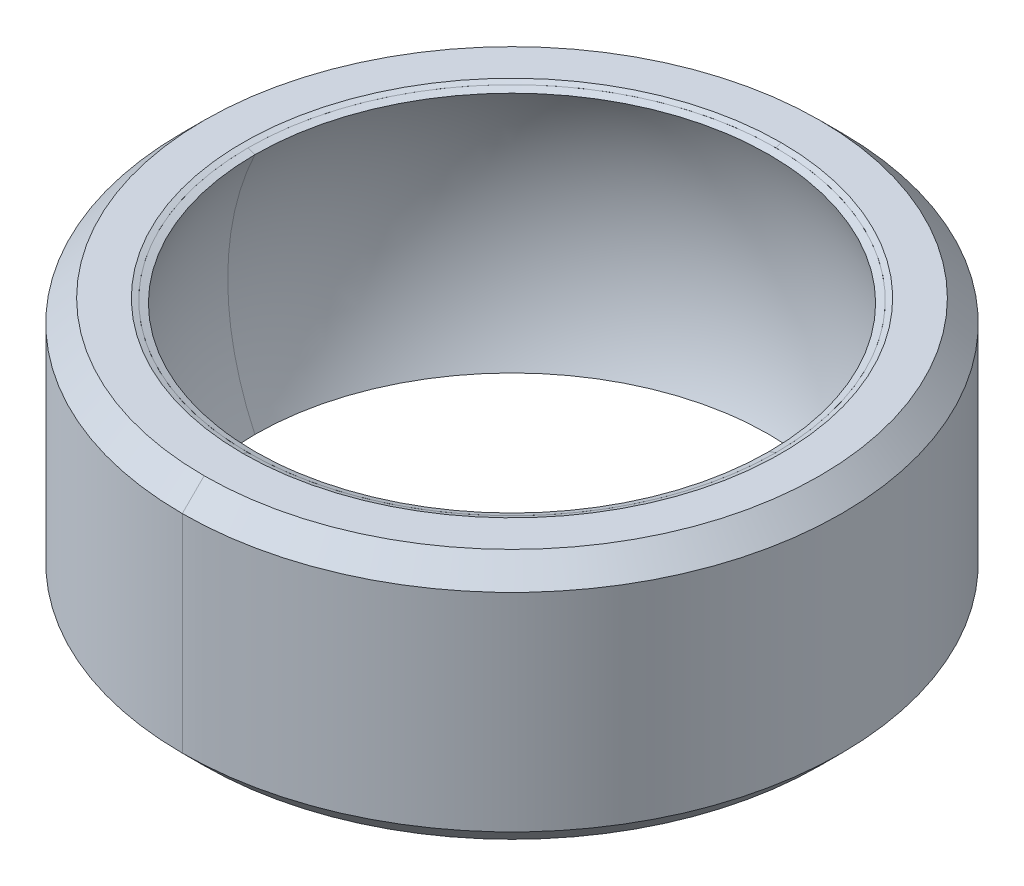
ISO-10303-21;
HEADER;
FILE_DESCRIPTION(('STEP AP214'),'2;1');
FILE_NAME('part.step','',(''),(''),'','','');
FILE_SCHEMA(('AUTOMOTIVE_DESIGN { 1 0 10303 214 1 1 1 1 }'));
ENDSEC;
DATA;
#1=APPLICATION_CONTEXT('core data for automotive mechanical design processes');
#2=APPLICATION_PROTOCOL_DEFINITION('international standard','automotive_design',2000,#1);
#3=PRODUCT_CONTEXT('',#1,'mechanical');
#4=PRODUCT('Part','Part','',(#3));
#5=PRODUCT_RELATED_PRODUCT_CATEGORY('part','',(#4));
#6=PRODUCT_DEFINITION_FORMATION('','',#4);
#7=PRODUCT_DEFINITION_CONTEXT('part definition',#1,'design');
#8=PRODUCT_DEFINITION('design','',#6,#7);
#9=PRODUCT_DEFINITION_SHAPE('','',#8);
#10=(LENGTH_UNIT() NAMED_UNIT(*) SI_UNIT(.MILLI.,.METRE.));
#11=(NAMED_UNIT(*) PLANE_ANGLE_UNIT() SI_UNIT($,.RADIAN.));
#12=(NAMED_UNIT(*) SI_UNIT($,.STERADIAN.) SOLID_ANGLE_UNIT());
#13=UNCERTAINTY_MEASURE_WITH_UNIT(LENGTH_MEASURE(1.E-05),#10,'distance_accuracy_value','');
#14=(GEOMETRIC_REPRESENTATION_CONTEXT(3) GLOBAL_UNCERTAINTY_ASSIGNED_CONTEXT((#13)) GLOBAL_UNIT_ASSIGNED_CONTEXT((#10,
#11,#12)) REPRESENTATION_CONTEXT('',''));
#15=CARTESIAN_POINT('',(0.,0.,0.));
#16=DIRECTION('',(0.,0.,1.));
#17=DIRECTION('',(1.,0.,0.));
#18=AXIS2_PLACEMENT_3D('',#15,#16,#17);
#19=CARTESIAN_POINT('',(0.,0.,0.));
#20=DIRECTION('',(0.,1.,0.));
#21=DIRECTION('',(0.,0.,-1.));
#22=AXIS2_PLACEMENT_3D('',#19,#20,#21);
#23=CYLINDRICAL_SURFACE('',#22,11.5062);
#24=DIRECTION('',(0.,1.,0.));
#25=VECTOR('',#24,1.);
#26=CARTESIAN_POINT('',(0.,0.,-11.5062));
#27=LINE('',#26,#25);
#28=CARTESIAN_POINT('',(0.,-3.6195,-11.5062));
#29=VERTEX_POINT('',#28);
#30=CARTESIAN_POINT('',(0.,3.6195,-11.5062));
#31=VERTEX_POINT('',#30);
#32=EDGE_CURVE('E30',#29,#31,#27,.T.);
#33=ORIENTED_EDGE('',*,*,#32,.F.);
#34=CARTESIAN_POINT('',(0.,-3.6195,0.));
#35=DIRECTION('',(0.,1.,0.));
#36=DIRECTION('',(0.,0.,-1.));
#37=AXIS2_PLACEMENT_3D('',#34,#35,#36);
#38=CIRCLE('',#37,11.5062);
#39=CARTESIAN_POINT('',(0.,-3.6195,11.5062));
#40=VERTEX_POINT('',#39);
#41=EDGE_CURVE('E146',#29,#40,#38,.T.);
#42=ORIENTED_EDGE('',*,*,#41,.T.);
#43=DIRECTION('',(0.,-1.,0.));
#44=VECTOR('',#43,1.);
#45=CARTESIAN_POINT('',(0.,0.,11.5062));
#46=LINE('',#45,#44);
#47=CARTESIAN_POINT('',(0.,3.6195,11.5062));
#48=VERTEX_POINT('',#47);
#49=EDGE_CURVE('E11',#48,#40,#46,.T.);
#50=ORIENTED_EDGE('',*,*,#49,.F.);
#51=CARTESIAN_POINT('',(0.,3.6195,0.));
#52=DIRECTION('',(0.,-1.,0.));
#53=DIRECTION('',(0.,0.,-1.));
#54=AXIS2_PLACEMENT_3D('',#51,#52,#53);
#55=CIRCLE('',#54,11.5062);
#56=EDGE_CURVE('E242',#48,#31,#55,.T.);
#57=ORIENTED_EDGE('',*,*,#56,.T.);
#58=EDGE_LOOP('',(#33,#42,#50,#57));
#59=FACE_BOUND('',#58,.T.);
#60=ADVANCED_FACE('F17',(#59),#23,.T.);
#61=CARTESIAN_POINT('',(0.,0.,0.));
#62=DIRECTION('',(0.,1.,0.));
#63=DIRECTION('',(0.,0.,-1.));
#64=AXIS2_PLACEMENT_3D('',#61,#62,#63);
#65=CYLINDRICAL_SURFACE('',#64,11.5062);
#66=ORIENTED_EDGE('',*,*,#32,.T.);
#67=CARTESIAN_POINT('',(0.,3.6195,0.));
#68=DIRECTION('',(0.,-1.,0.));
#69=DIRECTION('',(0.,0.,-1.));
#70=AXIS2_PLACEMENT_3D('',#67,#68,#69);
#71=CIRCLE('',#70,11.5062);
#72=EDGE_CURVE('E245',#31,#48,#71,.T.);
#73=ORIENTED_EDGE('',*,*,#72,.T.);
#74=ORIENTED_EDGE('',*,*,#49,.T.);
#75=CARTESIAN_POINT('',(0.,-3.6195,0.));
#76=DIRECTION('',(0.,1.,0.));
#77=DIRECTION('',(0.,0.,-1.));
#78=AXIS2_PLACEMENT_3D('',#75,#76,#77);
#79=CIRCLE('',#78,11.5062);
#80=EDGE_CURVE('E181',#40,#29,#79,.T.);
#81=ORIENTED_EDGE('',*,*,#80,.T.);
#82=EDGE_LOOP('',(#66,#73,#74,#81));
#83=FACE_BOUND('',#82,.T.);
#84=ADVANCED_FACE('F635',(#83),#65,.T.);
#85=CARTESIAN_POINT('',(0.,-4.0005,0.));
#86=DIRECTION('',(0.,1.,0.));
#87=DIRECTION('',(0.,0.,-1.));
#88=AXIS2_PLACEMENT_3D('',#85,#86,#87);
#89=CONICAL_SURFACE('',#88,11.1252,0.785398163397449);
#90=DIRECTION('',(0.,-0.707106781186547,0.707106781186548));
#91=VECTOR('',#90,1.);
#92=CARTESIAN_POINT('',(0.,-4.0005,-11.1252));
#93=LINE('',#92,#91);
#94=CARTESIAN_POINT('',(0.,-4.3815,-10.7442));
#95=VERTEX_POINT('',#94);
#96=EDGE_CURVE('E166',#29,#95,#93,.T.);
#97=ORIENTED_EDGE('',*,*,#96,.T.);
#98=CARTESIAN_POINT('',(0.,-4.3815,0.));
#99=DIRECTION('',(0.,-1.,0.));
#100=DIRECTION('',(0.,0.,-1.));
#101=AXIS2_PLACEMENT_3D('',#98,#99,#100);
#102=CIRCLE('',#101,10.7442);
#103=CARTESIAN_POINT('',(0.,-4.3815,10.7442));
#104=VERTEX_POINT('',#103);
#105=EDGE_CURVE('E162',#104,#95,#102,.T.);
#106=ORIENTED_EDGE('',*,*,#105,.F.);
#107=DIRECTION('',(0.,0.707106781186547,0.707106781186548));
#108=VECTOR('',#107,1.);
#109=CARTESIAN_POINT('',(0.,-4.0005,11.1252));
#110=LINE('',#109,#108);
#111=EDGE_CURVE('E176',#104,#40,#110,.T.);
#112=ORIENTED_EDGE('',*,*,#111,.T.);
#113=ORIENTED_EDGE('',*,*,#41,.F.);
#114=EDGE_LOOP('',(#97,#106,#112,#113));
#115=FACE_BOUND('',#114,.T.);
#116=ADVANCED_FACE('F585',(#115),#89,.T.);
#117=CARTESIAN_POINT('',(0.,4.0005,0.));
#118=DIRECTION('',(0.,-1.,0.));
#119=DIRECTION('',(0.,0.,-1.));
#120=AXIS2_PLACEMENT_3D('',#117,#118,#119);
#121=CONICAL_SURFACE('',#120,11.1252,0.785398163397449);
#122=DIRECTION('',(0.,0.707106781186547,0.707106781186548));
#123=VECTOR('',#122,1.);
#124=CARTESIAN_POINT('',(0.,4.0005,-11.1252));
#125=LINE('',#124,#123);
#126=CARTESIAN_POINT('',(0.,4.3815,-10.7442));
#127=VERTEX_POINT('',#126);
#128=EDGE_CURVE('E180',#31,#127,#125,.T.);
#129=ORIENTED_EDGE('',*,*,#128,.F.);
#130=ORIENTED_EDGE('',*,*,#56,.F.);
#131=DIRECTION('',(0.,-0.707106781186547,0.707106781186548));
#132=VECTOR('',#131,1.);
#133=CARTESIAN_POINT('',(0.,4.0005,11.1252));
#134=LINE('',#133,#132);
#135=CARTESIAN_POINT('',(0.,4.3815,10.7442));
#136=VERTEX_POINT('',#135);
#137=EDGE_CURVE('E23',#136,#48,#134,.T.);
#138=ORIENTED_EDGE('',*,*,#137,.F.);
#139=CARTESIAN_POINT('',(0.,4.3815,0.));
#140=DIRECTION('',(0.,1.,0.));
#141=DIRECTION('',(0.,0.,-1.));
#142=AXIS2_PLACEMENT_3D('',#139,#140,#141);
#143=CIRCLE('',#142,10.7442);
#144=EDGE_CURVE('E198',#127,#136,#143,.T.);
#145=ORIENTED_EDGE('',*,*,#144,.F.);
#146=EDGE_LOOP('',(#129,#130,#138,#145));
#147=FACE_BOUND('',#146,.T.);
#148=ADVANCED_FACE('F581',(#147),#121,.T.);
#149=CARTESIAN_POINT('',(0.,4.0005,0.));
#150=DIRECTION('',(0.,-1.,0.));
#151=DIRECTION('',(0.,0.,-1.));
#152=AXIS2_PLACEMENT_3D('',#149,#150,#151);
#153=CONICAL_SURFACE('',#152,11.1252,0.785398163397449);
#154=ORIENTED_EDGE('',*,*,#128,.T.);
#155=CARTESIAN_POINT('',(0.,4.3815,0.));
#156=DIRECTION('',(0.,1.,0.));
#157=DIRECTION('',(0.,0.,-1.));
#158=AXIS2_PLACEMENT_3D('',#155,#156,#157);
#159=CIRCLE('',#158,10.7442);
#160=EDGE_CURVE('E194',#136,#127,#159,.T.);
#161=ORIENTED_EDGE('',*,*,#160,.F.);
#162=ORIENTED_EDGE('',*,*,#137,.T.);
#163=ORIENTED_EDGE('',*,*,#72,.F.);
#164=EDGE_LOOP('',(#154,#161,#162,#163));
#165=FACE_BOUND('',#164,.T.);
#166=ADVANCED_FACE('F553',(#165),#153,.T.);
#167=CARTESIAN_POINT('',(0.,-4.0005,0.));
#168=DIRECTION('',(0.,1.,0.));
#169=DIRECTION('',(0.,0.,-1.));
#170=AXIS2_PLACEMENT_3D('',#167,#168,#169);
#171=CONICAL_SURFACE('',#170,11.1252,0.785398163397449);
#172=ORIENTED_EDGE('',*,*,#96,.F.);
#173=ORIENTED_EDGE('',*,*,#80,.F.);
#174=ORIENTED_EDGE('',*,*,#111,.F.);
#175=CARTESIAN_POINT('',(0.,-4.3815,0.));
#176=DIRECTION('',(0.,-1.,0.));
#177=DIRECTION('',(0.,0.,-1.));
#178=AXIS2_PLACEMENT_3D('',#175,#176,#177);
#179=CIRCLE('',#178,10.7442);
#180=EDGE_CURVE('E167',#95,#104,#179,.T.);
#181=ORIENTED_EDGE('',*,*,#180,.F.);
#182=EDGE_LOOP('',(#172,#173,#174,#181));
#183=FACE_BOUND('',#182,.T.);
#184=ADVANCED_FACE('F549',(#183),#171,.T.);
#185=CARTESIAN_POINT('',(0.,-4.3815,0.));
#186=DIRECTION('',(0.,-1.,0.));
#187=DIRECTION('',(0.,0.,-1.));
#188=AXIS2_PLACEMENT_3D('',#185,#186,#187);
#189=PLANE('',#188);
#190=ORIENTED_EDGE('',*,*,#180,.T.);
#191=ORIENTED_EDGE('',*,*,#105,.T.);
#192=EDGE_LOOP('',(#190,#191));
#193=FACE_BOUND('',#192,.T.);
#194=CARTESIAN_POINT('',(0.,-4.3815,0.));
#195=DIRECTION('',(0.,1.,0.));
#196=DIRECTION('',(0.,0.,-1.));
#197=AXIS2_PLACEMENT_3D('',#194,#195,#196);
#198=CIRCLE('',#197,9.39442180619351);
#199=CARTESIAN_POINT('',(0.,-4.3815,-9.39442180619351));
#200=VERTEX_POINT('',#199);
#201=CARTESIAN_POINT('',(0.,-4.3815,9.39442180619351));
#202=VERTEX_POINT('',#201);
#203=EDGE_CURVE('E228',#200,#202,#198,.T.);
#204=ORIENTED_EDGE('',*,*,#203,.T.);
#205=CARTESIAN_POINT('',(0.,-4.3815,0.));
#206=DIRECTION('',(0.,1.,0.));
#207=DIRECTION('',(0.,0.,-1.));
#208=AXIS2_PLACEMENT_3D('',#205,#206,#207);
#209=CIRCLE('',#208,9.39442180619351);
#210=EDGE_CURVE('E262',#202,#200,#209,.T.);
#211=ORIENTED_EDGE('',*,*,#210,.T.);
#212=EDGE_LOOP('',(#204,#211));
#213=FACE_BOUND('',#212,.T.);
#214=ADVANCED_FACE('F288',(#193,#213),#189,.T.);
#215=CARTESIAN_POINT('',(0.,4.3815,0.));
#216=DIRECTION('',(0.,1.,0.));
#217=DIRECTION('',(1.,0.,0.));
#218=AXIS2_PLACEMENT_3D('',#215,#216,#217);
#219=PLANE('',#218);
#220=ORIENTED_EDGE('',*,*,#144,.T.);
#221=ORIENTED_EDGE('',*,*,#160,.T.);
#222=EDGE_LOOP('',(#220,#221));
#223=FACE_BOUND('',#222,.T.);
#224=CARTESIAN_POINT('',(0.,4.3815,0.));
#225=DIRECTION('',(0.,-1.,0.));
#226=DIRECTION('',(0.,0.,-1.));
#227=AXIS2_PLACEMENT_3D('',#224,#225,#226);
#228=CIRCLE('',#227,9.39442180619351);
#229=CARTESIAN_POINT('',(0.,4.3815,-9.39442180619351));
#230=VERTEX_POINT('',#229);
#231=CARTESIAN_POINT('',(0.,4.3815,9.39442180619351));
#232=VERTEX_POINT('',#231);
#233=EDGE_CURVE('E222',#230,#232,#228,.T.);
#234=ORIENTED_EDGE('',*,*,#233,.T.);
#235=CARTESIAN_POINT('',(0.,4.3815,0.));
#236=DIRECTION('',(0.,-1.,0.));
#237=DIRECTION('',(0.,0.,-1.));
#238=AXIS2_PLACEMENT_3D('',#235,#236,#237);
#239=CIRCLE('',#238,9.39442180619351);
#240=EDGE_CURVE('E186',#232,#230,#239,.T.);
#241=ORIENTED_EDGE('',*,*,#240,.T.);
#242=EDGE_LOOP('',(#234,#241));
#243=FACE_BOUND('',#242,.T.);
#244=ADVANCED_FACE('F626',(#223,#243),#219,.T.);
#245=CARTESIAN_POINT('',(0.,-4.29124721093459,0.));
#246=DIRECTION('',(0.,-1.,0.));
#247=DIRECTION('',(0.,0.,-1.));
#248=AXIS2_PLACEMENT_3D('',#245,#246,#247);
#249=CONICAL_SURFACE('',#248,9.14645430619351,1.22173047639603);
#250=DIRECTION('',(0.,0.342020143325669,0.939692620785908));
#251=VECTOR('',#250,1.);
#252=CARTESIAN_POINT('',(0.,-4.29124721093459,-9.14645430619351));
#253=LINE('',#252,#251);
#254=CARTESIAN_POINT('',(0.,-4.31534720597061,-9.21266849836393));
#255=VERTEX_POINT('',#254);
#256=EDGE_CURVE('E226',#200,#255,#253,.T.);
#257=ORIENTED_EDGE('',*,*,#256,.T.);
#258=CARTESIAN_POINT('',(0.,-4.31534720597061,0.));
#259=DIRECTION('',(0.,1.,0.));
#260=DIRECTION('',(0.,0.,-1.));
#261=AXIS2_PLACEMENT_3D('',#258,#259,#260);
#262=CIRCLE('',#261,9.21266849836393);
#263=CARTESIAN_POINT('',(-9.21266849836393,-4.31534720597061,0.));
#264=VERTEX_POINT('',#263);
#265=EDGE_CURVE('E212',#255,#264,#262,.T.);
#266=ORIENTED_EDGE('',*,*,#265,.T.);
#267=CARTESIAN_POINT('',(0.,-4.31534720597061,0.));
#268=DIRECTION('',(0.,1.,0.));
#269=DIRECTION('',(0.,0.,-1.));
#270=AXIS2_PLACEMENT_3D('',#267,#268,#269);
#271=CIRCLE('',#270,9.21266849836393);
#272=CARTESIAN_POINT('',(0.,-4.31534720597061,9.21266849836393));
#273=VERTEX_POINT('',#272);
#274=EDGE_CURVE('E202',#264,#273,#271,.T.);
#275=ORIENTED_EDGE('',*,*,#274,.T.);
#276=DIRECTION('',(0.,-0.342020143325669,0.939692620785908));
#277=VECTOR('',#276,1.);
#278=CARTESIAN_POINT('',(0.,-4.2912472109346,9.14645430619351));
#279=LINE('',#278,#277);
#280=EDGE_CURVE('E232',#273,#202,#279,.T.);
#281=ORIENTED_EDGE('',*,*,#280,.T.);
#282=ORIENTED_EDGE('',*,*,#203,.F.);
#283=EDGE_LOOP('',(#257,#266,#275,#281,#282));
#284=FACE_BOUND('',#283,.T.);
#285=ADVANCED_FACE('F277',(#284),#249,.F.);
#286=CARTESIAN_POINT('',(0.,-4.29124721093459,0.));
#287=DIRECTION('',(0.,-1.,0.));
#288=DIRECTION('',(0.,0.,-1.));
#289=AXIS2_PLACEMENT_3D('',#286,#287,#288);
#290=CONICAL_SURFACE('',#289,9.14645430619351,1.22173047639603);
#291=ORIENTED_EDGE('',*,*,#256,.F.);
#292=ORIENTED_EDGE('',*,*,#210,.F.);
#293=ORIENTED_EDGE('',*,*,#280,.F.);
#294=CARTESIAN_POINT('',(0.,-4.31534720597061,0.));
#295=DIRECTION('',(0.,1.,0.));
#296=DIRECTION('',(0.,0.,-1.));
#297=AXIS2_PLACEMENT_3D('',#294,#295,#296);
#298=CIRCLE('',#297,9.21266849836393);
#299=CARTESIAN_POINT('',(9.21266849836393,-4.31534720597061,0.));
#300=VERTEX_POINT('',#299);
#301=EDGE_CURVE('E199',#273,#300,#298,.T.);
#302=ORIENTED_EDGE('',*,*,#301,.T.);
#303=CARTESIAN_POINT('',(0.,-4.31534720597061,0.));
#304=DIRECTION('',(0.,1.,0.));
#305=DIRECTION('',(0.,0.,-1.));
#306=AXIS2_PLACEMENT_3D('',#303,#304,#305);
#307=CIRCLE('',#306,9.21266849836393);
#308=EDGE_CURVE('E187',#300,#255,#307,.T.);
#309=ORIENTED_EDGE('',*,*,#308,.T.);
#310=EDGE_LOOP('',(#291,#292,#293,#302,#309));
#311=FACE_BOUND('',#310,.T.);
#312=ADVANCED_FACE('F286',(#311),#290,.F.);
#313=CARTESIAN_POINT('',(0.,4.29124721093459,0.));
#314=DIRECTION('',(0.,1.,0.));
#315=DIRECTION('',(0.,0.,-1.));
#316=AXIS2_PLACEMENT_3D('',#313,#314,#315);
#317=CONICAL_SURFACE('',#316,9.14645430619351,1.22173047639603);
#318=DIRECTION('',(0.,-0.342020143325669,0.939692620785908));
#319=VECTOR('',#318,1.);
#320=CARTESIAN_POINT('',(0.,4.29124721093459,-9.14645430619351));
#321=LINE('',#320,#319);
#322=CARTESIAN_POINT('',(0.,4.31534720597061,-9.21266849836392));
#323=VERTEX_POINT('',#322);
#324=EDGE_CURVE('E182',#230,#323,#321,.T.);
#325=ORIENTED_EDGE('',*,*,#324,.T.);
#326=CARTESIAN_POINT('',(0.,4.31534720597061,0.));
#327=DIRECTION('',(0.,-1.,0.));
#328=DIRECTION('',(0.,0.,-1.));
#329=AXIS2_PLACEMENT_3D('',#326,#327,#328);
#330=CIRCLE('',#329,9.21266849836392);
#331=CARTESIAN_POINT('',(9.21266849836392,4.31534720597061,0.));
#332=VERTEX_POINT('',#331);
#333=EDGE_CURVE('E148',#323,#332,#330,.T.);
#334=ORIENTED_EDGE('',*,*,#333,.T.);
#335=CARTESIAN_POINT('',(0.,4.31534720597061,0.));
#336=DIRECTION('',(0.,-1.,0.));
#337=DIRECTION('',(0.,0.,-1.));
#338=AXIS2_PLACEMENT_3D('',#335,#336,#337);
#339=CIRCLE('',#338,9.21266849836392);
#340=CARTESIAN_POINT('',(0.,4.31534720597061,9.21266849836392));
#341=VERTEX_POINT('',#340);
#342=EDGE_CURVE('E152',#332,#341,#339,.T.);
#343=ORIENTED_EDGE('',*,*,#342,.T.);
#344=DIRECTION('',(0.,0.342020143325669,0.939692620785908));
#345=VECTOR('',#344,1.);
#346=CARTESIAN_POINT('',(0.,4.2912472109346,9.14645430619351));
#347=LINE('',#346,#345);
#348=EDGE_CURVE('E227',#341,#232,#347,.T.);
#349=ORIENTED_EDGE('',*,*,#348,.T.);
#350=ORIENTED_EDGE('',*,*,#233,.F.);
#351=EDGE_LOOP('',(#325,#334,#343,#349,#350));
#352=FACE_BOUND('',#351,.T.);
#353=ADVANCED_FACE('F395',(#352),#317,.F.);
#354=CARTESIAN_POINT('',(0.,4.29124721093459,0.));
#355=DIRECTION('',(0.,1.,0.));
#356=DIRECTION('',(0.,0.,-1.));
#357=AXIS2_PLACEMENT_3D('',#354,#355,#356);
#358=CONICAL_SURFACE('',#357,9.14645430619351,1.22173047639603);
#359=ORIENTED_EDGE('',*,*,#324,.F.);
#360=ORIENTED_EDGE('',*,*,#240,.F.);
#361=ORIENTED_EDGE('',*,*,#348,.F.);
#362=CARTESIAN_POINT('',(0.,4.31534720597061,0.));
#363=DIRECTION('',(0.,-1.,0.));
#364=DIRECTION('',(0.,0.,-1.));
#365=AXIS2_PLACEMENT_3D('',#362,#363,#364);
#366=CIRCLE('',#365,9.21266849836392);
#367=CARTESIAN_POINT('',(-9.21266849836392,4.31534720597061,0.));
#368=VERTEX_POINT('',#367);
#369=EDGE_CURVE('E236',#341,#368,#366,.T.);
#370=ORIENTED_EDGE('',*,*,#369,.T.);
#371=CARTESIAN_POINT('',(0.,4.31534720597061,0.));
#372=DIRECTION('',(0.,-1.,0.));
#373=DIRECTION('',(0.,0.,-1.));
#374=AXIS2_PLACEMENT_3D('',#371,#372,#373);
#375=CIRCLE('',#374,9.21266849836392);
#376=EDGE_CURVE('E151',#368,#323,#375,.T.);
#377=ORIENTED_EDGE('',*,*,#376,.T.);
#378=EDGE_LOOP('',(#359,#360,#361,#370,#377));
#379=FACE_BOUND('',#378,.T.);
#380=ADVANCED_FACE('F399',(#379),#358,.F.);
#381=CARTESIAN_POINT('',(0.,-10.1663697690403,0.));
#382=CARTESIAN_POINT('',(0.,-10.1663697690403,0.));
#383=CARTESIAN_POINT('',(0.,-10.1663697690403,0.));
#384=CARTESIAN_POINT('',(0.,-10.1663697690403,0.));
#385=CARTESIAN_POINT('',(0.,-10.1663697690403,0.));
#386=CARTESIAN_POINT('',(-5.87294364690901,-10.1707719370903,0.));
#387=CARTESIAN_POINT('',(-5.87294364690901,-10.1707719370903,-5.87294364690901));
#388=CARTESIAN_POINT('',(0.,-10.1707719370903,-5.87294364690901));
#389=CARTESIAN_POINT('',(5.87294364690901,-10.1707719370903,-5.87294364690901));
#390=CARTESIAN_POINT('',(5.87294364690901,-10.1707719370903,0.));
#391=CARTESIAN_POINT('',(-8.81068700019515,-5.08538596854513,0.));
#392=CARTESIAN_POINT('',(-8.81068700019516,-5.08538596854513,-8.81068700019516));
#393=CARTESIAN_POINT('',(0.,-5.08538596854513,-8.81068700019515));
#394=CARTESIAN_POINT('',(8.81068700019516,-5.08538596854513,-8.81068700019516));
#395=CARTESIAN_POINT('',(8.81068700019515,-5.08538596854513,0.));
#396=CARTESIAN_POINT('',(-11.7484303534813,0.,0.));
#397=CARTESIAN_POINT('',(-11.7484303534813,0.,-11.7484303534813));
#398=CARTESIAN_POINT('',(0.,0.,-11.7484303534813));
#399=CARTESIAN_POINT('',(11.7484303534813,0.,-11.7484303534813));
#400=CARTESIAN_POINT('',(11.7484303534813,0.,0.));
#401=CARTESIAN_POINT('',(-8.81068700019515,5.08538596854511,0.));
#402=CARTESIAN_POINT('',(-8.81068700019516,5.08538596854511,-8.81068700019516));
#403=CARTESIAN_POINT('',(0.,5.08538596854511,-8.81068700019515));
#404=CARTESIAN_POINT('',(8.81068700019516,5.08538596854511,-8.81068700019516));
#405=CARTESIAN_POINT('',(8.81068700019515,5.08538596854511,0.));
#406=CARTESIAN_POINT('',(-5.87294364690901,10.1707719370902,0.));
#407=CARTESIAN_POINT('',(-5.87294364690901,10.1707719370902,-5.87294364690901));
#408=CARTESIAN_POINT('',(0.,10.1707719370902,-5.87294364690901));
#409=CARTESIAN_POINT('',(5.87294364690901,10.1707719370902,-5.87294364690901));
#410=CARTESIAN_POINT('',(5.87294364690902,10.1707719370902,0.));
#411=CARTESIAN_POINT('',(0.,10.1663697690403,0.));
#412=CARTESIAN_POINT('',(0.,10.1663697690403,0.));
#413=CARTESIAN_POINT('',(0.,10.1663697690403,0.));
#414=CARTESIAN_POINT('',(0.,10.1663697690403,0.));
#415=CARTESIAN_POINT('',(0.,10.1663697690403,0.));
#416=(BOUNDED_SURFACE() B_SPLINE_SURFACE(2,2,((#381,#382,#383,#384,#385),(#386,#387,#388,#389,
#390),(#391,#392,#393,#394,#395),(#396,#397,#398,#399,#400),(#401,#402,#403,#404,#405),(#406,
#407,#408,#409,#410),(#411,#412,#413,#414,#415)),.UNSPECIFIED.,.F.,.F.,
.F.) B_SPLINE_SURFACE_WITH_KNOTS((3,2,2,3),(3,2,3),(1.57004675937349,2.61774402218436,
3.66544128499523,4.71313854780609),(3.14159265358979,4.71238898038469,6.28318530717959),
.UNSPECIFIED.) GEOMETRIC_REPRESENTATION_ITEM() RATIONAL_B_SPLINE_SURFACE(((1.,0.707106781186548,
1.,0.707106781186548,1.),(0.865900448850085,0.61228407921437,0.865900448850085,0.61228407921437,
0.865900448850085),(1.,0.707106781186548,1.,0.707106781186548,1.),(0.865900448850086,
0.612284079214371,0.865900448850086,0.612284079214371,0.865900448850086),(1.,0.707106781186548,
1.,0.707106781186548,1.),(0.865900448850087,0.612284079214372,0.865900448850087,
0.612284079214372,0.865900448850087),(1.,0.707106781186548,1.,0.707106781186548,1.))) REPRESENTATION_ITEM('') SURFACE());
#417=CARTESIAN_POINT('',(0.00762038100000198,0.,0.));
#418=DIRECTION('',(0.,0.,-1.));
#419=DIRECTION('',(1.,0.,0.));
#420=AXIS2_PLACEMENT_3D('',#417,#418,#419);
#421=CIRCLE('',#420,10.1663726250351);
#422=CARTESIAN_POINT('',(9.212634805729,-4.31541907485178,0.));
#423=VERTEX_POINT('',#422);
#424=EDGE_CURVE('E191',#300,#423,#421,.T.);
#425=CARTESIAN_POINT('',(0.,-4.31541907485178,0.));
#426=DIRECTION('',(0.,1.,0.));
#427=DIRECTION('',(1.,0.,0.));
#428=AXIS2_PLACEMENT_3D('',#425,#426,#427);
#429=CIRCLE('',#428,9.212634805729);
#430=CARTESIAN_POINT('',(-9.212634805729,-4.31541907485178,0.));
#431=VERTEX_POINT('',#430);
#432=EDGE_CURVE('E173',#423,#431,#429,.T.);
#433=CARTESIAN_POINT('',(-0.00762038100000198,0.,0.));
#434=DIRECTION('',(0.,0.,-1.));
#435=DIRECTION('',(-1.,0.,0.));
#436=AXIS2_PLACEMENT_3D('',#433,#434,#435);
#437=CIRCLE('',#436,10.1663726250351);
#438=EDGE_CURVE('E209',#431,#264,#437,.T.);
#439=ORIENTED_EDGE('',*,*,#424,.T.);
#440=ORIENTED_EDGE('',*,*,#432,.T.);
#441=ORIENTED_EDGE('',*,*,#438,.T.);
#442=ORIENTED_EDGE('',*,*,#265,.F.);
#443=ORIENTED_EDGE('',*,*,#308,.F.);
#444=EDGE_LOOP('',(#439,#440,#441,#442,#443));
#445=FACE_BOUND('',#444,.T.);
#446=ADVANCED_FACE('F569',(#445),#416,.T.);
#447=CARTESIAN_POINT('',(0.,-10.1663697690403,0.));
#448=CARTESIAN_POINT('',(0.,-10.1663697690403,0.));
#449=CARTESIAN_POINT('',(0.,-10.1663697690403,0.));
#450=CARTESIAN_POINT('',(0.,-10.1663697690403,0.));
#451=CARTESIAN_POINT('',(0.,-10.1663697690403,0.));
#452=CARTESIAN_POINT('',(5.87294364690901,-10.1707719370903,0.));
#453=CARTESIAN_POINT('',(5.87294364690901,-10.1707719370903,5.87294364690901));
#454=CARTESIAN_POINT('',(0.,-10.1707719370903,5.87294364690901));
#455=CARTESIAN_POINT('',(-5.87294364690901,-10.1707719370903,5.87294364690901));
#456=CARTESIAN_POINT('',(-5.87294364690901,-10.1707719370903,0.));
#457=CARTESIAN_POINT('',(8.81068700019515,-5.08538596854513,0.));
#458=CARTESIAN_POINT('',(8.81068700019516,-5.08538596854513,8.81068700019516));
#459=CARTESIAN_POINT('',(0.,-5.08538596854513,8.81068700019515));
#460=CARTESIAN_POINT('',(-8.81068700019516,-5.08538596854513,8.81068700019516));
#461=CARTESIAN_POINT('',(-8.81068700019515,-5.08538596854513,0.));
#462=CARTESIAN_POINT('',(11.7484303534813,0.,0.));
#463=CARTESIAN_POINT('',(11.7484303534813,0.,11.7484303534813));
#464=CARTESIAN_POINT('',(0.,0.,11.7484303534813));
#465=CARTESIAN_POINT('',(-11.7484303534813,0.,11.7484303534813));
#466=CARTESIAN_POINT('',(-11.7484303534813,0.,0.));
#467=CARTESIAN_POINT('',(8.81068700019515,5.08538596854511,0.));
#468=CARTESIAN_POINT('',(8.81068700019516,5.08538596854511,8.81068700019516));
#469=CARTESIAN_POINT('',(0.,5.08538596854511,8.81068700019515));
#470=CARTESIAN_POINT('',(-8.81068700019516,5.08538596854511,8.81068700019516));
#471=CARTESIAN_POINT('',(-8.81068700019515,5.08538596854511,0.));
#472=CARTESIAN_POINT('',(5.87294364690902,10.1707719370902,0.));
#473=CARTESIAN_POINT('',(5.87294364690901,10.1707719370902,5.87294364690901));
#474=CARTESIAN_POINT('',(0.,10.1707719370902,5.87294364690902));
#475=CARTESIAN_POINT('',(-5.87294364690901,10.1707719370902,5.87294364690901));
#476=CARTESIAN_POINT('',(-5.87294364690901,10.1707719370902,0.));
#477=CARTESIAN_POINT('',(0.,10.1663697690403,0.));
#478=CARTESIAN_POINT('',(0.,10.1663697690403,0.));
#479=CARTESIAN_POINT('',(0.,10.1663697690403,0.));
#480=CARTESIAN_POINT('',(0.,10.1663697690403,0.));
#481=CARTESIAN_POINT('',(0.,10.1663697690403,0.));
#482=(BOUNDED_SURFACE() B_SPLINE_SURFACE(2,2,((#447,#448,#449,#450,#451),(#452,#453,#454,#455,
#456),(#457,#458,#459,#460,#461),(#462,#463,#464,#465,#466),(#467,#468,#469,#470,#471),(#472,
#473,#474,#475,#476),(#477,#478,#479,#480,#481)),.UNSPECIFIED.,.F.,.F.,
.F.) B_SPLINE_SURFACE_WITH_KNOTS((3,2,2,3),(3,2,3),(1.57004675937349,2.61774402218436,
3.66544128499523,4.71313854780609),(0.,1.5707963267949,3.14159265358979),
.UNSPECIFIED.) GEOMETRIC_REPRESENTATION_ITEM() RATIONAL_B_SPLINE_SURFACE(((1.,0.707106781186548,
1.,0.707106781186548,1.),(0.865900448850085,0.61228407921437,0.865900448850085,0.61228407921437,
0.865900448850085),(1.,0.707106781186548,1.,0.707106781186548,1.),(0.865900448850086,
0.612284079214371,0.865900448850086,0.612284079214371,0.865900448850086),(1.,0.707106781186548,
1.,0.707106781186548,1.),(0.865900448850087,0.612284079214372,0.865900448850087,
0.612284079214372,0.865900448850087),(1.,0.707106781186548,1.,0.707106781186548,1.))) REPRESENTATION_ITEM('') SURFACE());
#483=CARTESIAN_POINT('',(0.,-4.31541907485178,0.));
#484=DIRECTION('',(0.,1.,0.));
#485=DIRECTION('',(1.,0.,0.));
#486=AXIS2_PLACEMENT_3D('',#483,#484,#485);
#487=CIRCLE('',#486,9.212634805729);
#488=EDGE_CURVE('E157',#431,#423,#487,.T.);
#489=ORIENTED_EDGE('',*,*,#424,.F.);
#490=ORIENTED_EDGE('',*,*,#301,.F.);
#491=ORIENTED_EDGE('',*,*,#274,.F.);
#492=ORIENTED_EDGE('',*,*,#438,.F.);
#493=ORIENTED_EDGE('',*,*,#488,.T.);
#494=EDGE_LOOP('',(#489,#490,#491,#492,#493));
#495=FACE_BOUND('',#494,.T.);
#496=ADVANCED_FACE('F565',(#495),#482,.T.);
#497=CARTESIAN_POINT('',(0.,-10.1663697690403,0.));
#498=CARTESIAN_POINT('',(0.,-10.1663697690403,0.));
#499=CARTESIAN_POINT('',(0.,-10.1663697690403,0.));
#500=CARTESIAN_POINT('',(0.,-10.1663697690403,0.));
#501=CARTESIAN_POINT('',(0.,-10.1663697690403,0.));
#502=CARTESIAN_POINT('',(-5.87294364690901,-10.1707719370903,0.));
#503=CARTESIAN_POINT('',(-5.87294364690901,-10.1707719370903,-5.87294364690901));
#504=CARTESIAN_POINT('',(0.,-10.1707719370903,-5.87294364690901));
#505=CARTESIAN_POINT('',(5.87294364690901,-10.1707719370903,-5.87294364690901));
#506=CARTESIAN_POINT('',(5.87294364690901,-10.1707719370903,0.));
#507=CARTESIAN_POINT('',(-8.81068700019515,-5.08538596854513,0.));
#508=CARTESIAN_POINT('',(-8.81068700019516,-5.08538596854513,-8.81068700019516));
#509=CARTESIAN_POINT('',(0.,-5.08538596854513,-8.81068700019515));
#510=CARTESIAN_POINT('',(8.81068700019516,-5.08538596854513,-8.81068700019516));
#511=CARTESIAN_POINT('',(8.81068700019515,-5.08538596854513,0.));
#512=CARTESIAN_POINT('',(-11.7484303534813,0.,0.));
#513=CARTESIAN_POINT('',(-11.7484303534813,0.,-11.7484303534813));
#514=CARTESIAN_POINT('',(0.,0.,-11.7484303534813));
#515=CARTESIAN_POINT('',(11.7484303534813,0.,-11.7484303534813));
#516=CARTESIAN_POINT('',(11.7484303534813,0.,0.));
#517=CARTESIAN_POINT('',(-8.81068700019515,5.08538596854511,0.));
#518=CARTESIAN_POINT('',(-8.81068700019516,5.08538596854511,-8.81068700019516));
#519=CARTESIAN_POINT('',(0.,5.08538596854511,-8.81068700019515));
#520=CARTESIAN_POINT('',(8.81068700019516,5.08538596854511,-8.81068700019516));
#521=CARTESIAN_POINT('',(8.81068700019515,5.08538596854511,0.));
#522=CARTESIAN_POINT('',(-5.87294364690901,10.1707719370902,0.));
#523=CARTESIAN_POINT('',(-5.87294364690901,10.1707719370902,-5.87294364690901));
#524=CARTESIAN_POINT('',(0.,10.1707719370902,-5.87294364690901));
#525=CARTESIAN_POINT('',(5.87294364690901,10.1707719370902,-5.87294364690901));
#526=CARTESIAN_POINT('',(5.87294364690902,10.1707719370902,0.));
#527=CARTESIAN_POINT('',(0.,10.1663697690403,0.));
#528=CARTESIAN_POINT('',(0.,10.1663697690403,0.));
#529=CARTESIAN_POINT('',(0.,10.1663697690403,0.));
#530=CARTESIAN_POINT('',(0.,10.1663697690403,0.));
#531=CARTESIAN_POINT('',(0.,10.1663697690403,0.));
#532=(BOUNDED_SURFACE() B_SPLINE_SURFACE(2,2,((#497,#498,#499,#500,#501),(#502,#503,#504,#505,
#506),(#507,#508,#509,#510,#511),(#512,#513,#514,#515,#516),(#517,#518,#519,#520,#521),(#522,
#523,#524,#525,#526),(#527,#528,#529,#530,#531)),.UNSPECIFIED.,.F.,.F.,
.F.) B_SPLINE_SURFACE_WITH_KNOTS((3,2,2,3),(3,2,3),(1.57004675937349,2.61774402218436,
3.66544128499523,4.71313854780609),(3.14159265358979,4.71238898038469,6.28318530717959),
.UNSPECIFIED.) GEOMETRIC_REPRESENTATION_ITEM() RATIONAL_B_SPLINE_SURFACE(((1.,0.707106781186548,
1.,0.707106781186548,1.),(0.865900448850085,0.61228407921437,0.865900448850085,0.61228407921437,
0.865900448850085),(1.,0.707106781186548,1.,0.707106781186548,1.),(0.865900448850086,
0.612284079214371,0.865900448850086,0.612284079214371,0.865900448850086),(1.,0.707106781186548,
1.,0.707106781186548,1.),(0.865900448850087,0.612284079214372,0.865900448850087,
0.612284079214372,0.865900448850087),(1.,0.707106781186548,1.,0.707106781186548,1.))) REPRESENTATION_ITEM('') SURFACE());
#533=CARTESIAN_POINT('',(0.00762038100000198,0.,0.));
#534=DIRECTION('',(0.,0.,-1.));
#535=DIRECTION('',(1.,0.,0.));
#536=AXIS2_PLACEMENT_3D('',#533,#534,#535);
#537=CIRCLE('',#536,10.1663726250351);
#538=CARTESIAN_POINT('',(9.21263480572899,4.31541907485178,0.));
#539=VERTEX_POINT('',#538);
#540=EDGE_CURVE('E168',#539,#332,#537,.T.);
#541=CARTESIAN_POINT('',(-0.00762038100000198,0.,0.));
#542=DIRECTION('',(0.,0.,-1.));
#543=DIRECTION('',(-1.,0.,0.));
#544=AXIS2_PLACEMENT_3D('',#541,#542,#543);
#545=CIRCLE('',#544,10.1663726250351);
#546=CARTESIAN_POINT('',(-9.21263480572899,4.31541907485178,0.));
#547=VERTEX_POINT('',#546);
#548=EDGE_CURVE('E172',#368,#547,#545,.T.);
#549=CARTESIAN_POINT('',(0.,4.31541907485178,0.));
#550=DIRECTION('',(0.,-1.,0.));
#551=DIRECTION('',(1.,0.,0.));
#552=AXIS2_PLACEMENT_3D('',#549,#550,#551);
#553=CIRCLE('',#552,9.21263480572899);
#554=EDGE_CURVE('E153',#547,#539,#553,.T.);
#555=ORIENTED_EDGE('',*,*,#540,.T.);
#556=ORIENTED_EDGE('',*,*,#333,.F.);
#557=ORIENTED_EDGE('',*,*,#376,.F.);
#558=ORIENTED_EDGE('',*,*,#548,.T.);
#559=ORIENTED_EDGE('',*,*,#554,.T.);
#560=EDGE_LOOP('',(#555,#556,#557,#558,#559));
#561=FACE_BOUND('',#560,.T.);
#562=ADVANCED_FACE('F403',(#561),#532,.T.);
#563=CARTESIAN_POINT('',(0.,-10.1663697690403,0.));
#564=CARTESIAN_POINT('',(0.,-10.1663697690403,0.));
#565=CARTESIAN_POINT('',(0.,-10.1663697690403,0.));
#566=CARTESIAN_POINT('',(0.,-10.1663697690403,0.));
#567=CARTESIAN_POINT('',(0.,-10.1663697690403,0.));
#568=CARTESIAN_POINT('',(5.87294364690901,-10.1707719370903,0.));
#569=CARTESIAN_POINT('',(5.87294364690901,-10.1707719370903,5.87294364690901));
#570=CARTESIAN_POINT('',(0.,-10.1707719370903,5.87294364690901));
#571=CARTESIAN_POINT('',(-5.87294364690901,-10.1707719370903,5.87294364690901));
#572=CARTESIAN_POINT('',(-5.87294364690901,-10.1707719370903,0.));
#573=CARTESIAN_POINT('',(8.81068700019515,-5.08538596854513,0.));
#574=CARTESIAN_POINT('',(8.81068700019516,-5.08538596854513,8.81068700019516));
#575=CARTESIAN_POINT('',(0.,-5.08538596854513,8.81068700019515));
#576=CARTESIAN_POINT('',(-8.81068700019516,-5.08538596854513,8.81068700019516));
#577=CARTESIAN_POINT('',(-8.81068700019515,-5.08538596854513,0.));
#578=CARTESIAN_POINT('',(11.7484303534813,0.,0.));
#579=CARTESIAN_POINT('',(11.7484303534813,0.,11.7484303534813));
#580=CARTESIAN_POINT('',(0.,0.,11.7484303534813));
#581=CARTESIAN_POINT('',(-11.7484303534813,0.,11.7484303534813));
#582=CARTESIAN_POINT('',(-11.7484303534813,0.,0.));
#583=CARTESIAN_POINT('',(8.81068700019515,5.08538596854511,0.));
#584=CARTESIAN_POINT('',(8.81068700019516,5.08538596854511,8.81068700019516));
#585=CARTESIAN_POINT('',(0.,5.08538596854511,8.81068700019515));
#586=CARTESIAN_POINT('',(-8.81068700019516,5.08538596854511,8.81068700019516));
#587=CARTESIAN_POINT('',(-8.81068700019515,5.08538596854511,0.));
#588=CARTESIAN_POINT('',(5.87294364690902,10.1707719370902,0.));
#589=CARTESIAN_POINT('',(5.87294364690901,10.1707719370902,5.87294364690901));
#590=CARTESIAN_POINT('',(0.,10.1707719370902,5.87294364690902));
#591=CARTESIAN_POINT('',(-5.87294364690901,10.1707719370902,5.87294364690901));
#592=CARTESIAN_POINT('',(-5.87294364690901,10.1707719370902,0.));
#593=CARTESIAN_POINT('',(0.,10.1663697690403,0.));
#594=CARTESIAN_POINT('',(0.,10.1663697690403,0.));
#595=CARTESIAN_POINT('',(0.,10.1663697690403,0.));
#596=CARTESIAN_POINT('',(0.,10.1663697690403,0.));
#597=CARTESIAN_POINT('',(0.,10.1663697690403,0.));
#598=(BOUNDED_SURFACE() B_SPLINE_SURFACE(2,2,((#563,#564,#565,#566,#567),(#568,#569,#570,#571,
#572),(#573,#574,#575,#576,#577),(#578,#579,#580,#581,#582),(#583,#584,#585,#586,#587),(#588,
#589,#590,#591,#592),(#593,#594,#595,#596,#597)),.UNSPECIFIED.,.F.,.F.,
.F.) B_SPLINE_SURFACE_WITH_KNOTS((3,2,2,3),(3,2,3),(1.57004675937349,2.61774402218436,
3.66544128499523,4.71313854780609),(0.,1.5707963267949,3.14159265358979),
.UNSPECIFIED.) GEOMETRIC_REPRESENTATION_ITEM() RATIONAL_B_SPLINE_SURFACE(((1.,0.707106781186548,
1.,0.707106781186548,1.),(0.865900448850085,0.61228407921437,0.865900448850085,0.61228407921437,
0.865900448850085),(1.,0.707106781186548,1.,0.707106781186548,1.),(0.865900448850086,
0.612284079214371,0.865900448850086,0.612284079214371,0.865900448850086),(1.,0.707106781186548,
1.,0.707106781186548,1.),(0.865900448850087,0.612284079214372,0.865900448850087,
0.612284079214372,0.865900448850087),(1.,0.707106781186548,1.,0.707106781186548,1.))) REPRESENTATION_ITEM('') SURFACE());
#599=CARTESIAN_POINT('',(0.,4.31541907485178,0.));
#600=DIRECTION('',(0.,-1.,0.));
#601=DIRECTION('',(1.,0.,0.));
#602=AXIS2_PLACEMENT_3D('',#599,#600,#601);
#603=CIRCLE('',#602,9.21263480572899);
#604=EDGE_CURVE('E111',#539,#547,#603,.T.);
#605=ORIENTED_EDGE('',*,*,#540,.F.);
#606=ORIENTED_EDGE('',*,*,#604,.T.);
#607=ORIENTED_EDGE('',*,*,#548,.F.);
#608=ORIENTED_EDGE('',*,*,#369,.F.);
#609=ORIENTED_EDGE('',*,*,#342,.F.);
#610=EDGE_LOOP('',(#605,#606,#607,#608,#609));
#611=FACE_BOUND('',#610,.T.);
#612=ADVANCED_FACE('F405',(#611),#598,.T.);
#613=CARTESIAN_POINT('',(0.,-2.67291705020321,0.));
#614=DIRECTION('',(0.,-1.,0.));
#615=DIRECTION('',(1.,0.,0.));
#616=AXIS2_PLACEMENT_3D('',#613,#614,#615);
#617=CONICAL_SURFACE('',#616,4.69744576364191,1.22190500932123);
#618=DIRECTION('',(0.93975230024936,-0.341856130815343,0.));
#619=VECTOR('',#618,1.);
#620=CARTESIAN_POINT('',(4.69744576364191,-2.67291705020321,0.));
#621=LINE('',#620,#619);
#622=CARTESIAN_POINT('',(8.97294189475016,-4.22822536315845,0.));
#623=VERTEX_POINT('',#622);
#624=EDGE_CURVE('E93',#623,#423,#621,.T.);
#625=ORIENTED_EDGE('',*,*,#624,.F.);
#626=CARTESIAN_POINT('',(0.,-4.22822536315845,0.));
#627=DIRECTION('',(0.,-1.,0.));
#628=DIRECTION('',(1.,0.,0.));
#629=AXIS2_PLACEMENT_3D('',#626,#627,#628);
#630=CIRCLE('',#629,8.97294189475016);
#631=CARTESIAN_POINT('',(-8.97294189475017,-4.22822536315844,0.));
#632=VERTEX_POINT('',#631);
#633=EDGE_CURVE('E124',#632,#623,#630,.T.);
#634=ORIENTED_EDGE('',*,*,#633,.F.);
#635=DIRECTION('',(0.93975230024936,0.341856130815342,0.));
#636=VECTOR('',#635,1.);
#637=CARTESIAN_POINT('',(-4.69744576364191,-2.67291705020321,0.));
#638=LINE('',#637,#636);
#639=EDGE_CURVE('E161',#431,#632,#638,.T.);
#640=ORIENTED_EDGE('',*,*,#639,.F.);
#641=ORIENTED_EDGE('',*,*,#432,.F.);
#642=EDGE_LOOP('',(#625,#634,#640,#641));
#643=FACE_BOUND('',#642,.T.);
#644=ADVANCED_FACE('F595',(#643),#617,.F.);
#645=CARTESIAN_POINT('',(0.,-2.67291705020321,0.));
#646=DIRECTION('',(0.,-1.,0.));
#647=DIRECTION('',(1.,0.,0.));
#648=AXIS2_PLACEMENT_3D('',#645,#646,#647);
#649=CONICAL_SURFACE('',#648,4.69744576364191,1.22190500932123);
#650=ORIENTED_EDGE('',*,*,#624,.T.);
#651=ORIENTED_EDGE('',*,*,#488,.F.);
#652=ORIENTED_EDGE('',*,*,#639,.T.);
#653=CARTESIAN_POINT('',(0.,-4.22822536315845,0.));
#654=DIRECTION('',(0.,-1.,0.));
#655=DIRECTION('',(1.,0.,0.));
#656=AXIS2_PLACEMENT_3D('',#653,#654,#655);
#657=CIRCLE('',#656,8.97294189475016);
#658=EDGE_CURVE('E133',#623,#632,#657,.T.);
#659=ORIENTED_EDGE('',*,*,#658,.F.);
#660=EDGE_LOOP('',(#650,#651,#652,#659));
#661=FACE_BOUND('',#660,.T.);
#662=ADVANCED_FACE('F591',(#661),#649,.F.);
#663=CARTESIAN_POINT('',(0.,2.67291705020321,0.));
#664=DIRECTION('',(0.,1.,0.));
#665=DIRECTION('',(1.,0.,0.));
#666=AXIS2_PLACEMENT_3D('',#663,#664,#665);
#667=CONICAL_SURFACE('',#666,4.69744576364191,1.22190500932123);
#668=DIRECTION('',(0.93975230024936,0.341856130815343,0.));
#669=VECTOR('',#668,1.);
#670=CARTESIAN_POINT('',(4.69744576364191,2.67291705020321,0.));
#671=LINE('',#670,#669);
#672=CARTESIAN_POINT('',(8.97294189475016,4.22822536315844,0.));
#673=VERTEX_POINT('',#672);
#674=EDGE_CURVE('E103',#673,#539,#671,.T.);
#675=ORIENTED_EDGE('',*,*,#674,.T.);
#676=ORIENTED_EDGE('',*,*,#554,.F.);
#677=DIRECTION('',(0.93975230024936,-0.341856130815343,0.));
#678=VECTOR('',#677,1.);
#679=CARTESIAN_POINT('',(-4.69744576364191,2.67291705020321,0.));
#680=LINE('',#679,#678);
#681=CARTESIAN_POINT('',(-8.97294189475016,4.22822536315845,0.));
#682=VERTEX_POINT('',#681);
#683=EDGE_CURVE('E115',#547,#682,#680,.T.);
#684=ORIENTED_EDGE('',*,*,#683,.T.);
#685=CARTESIAN_POINT('',(0.,4.22822536315844,0.));
#686=DIRECTION('',(0.,1.,0.));
#687=DIRECTION('',(1.,0.,0.));
#688=AXIS2_PLACEMENT_3D('',#685,#686,#687);
#689=CIRCLE('',#688,8.97294189475016);
#690=EDGE_CURVE('E116',#673,#682,#689,.T.);
#691=ORIENTED_EDGE('',*,*,#690,.F.);
#692=EDGE_LOOP('',(#675,#676,#684,#691));
#693=FACE_BOUND('',#692,.T.);
#694=ADVANCED_FACE('F120',(#693),#667,.F.);
#695=CARTESIAN_POINT('',(0.,2.67291705020321,0.));
#696=DIRECTION('',(0.,1.,0.));
#697=DIRECTION('',(1.,0.,0.));
#698=AXIS2_PLACEMENT_3D('',#695,#696,#697);
#699=CONICAL_SURFACE('',#698,4.69744576364191,1.22190500932123);
#700=ORIENTED_EDGE('',*,*,#674,.F.);
#701=CARTESIAN_POINT('',(0.,4.22822536315844,0.));
#702=DIRECTION('',(0.,1.,0.));
#703=DIRECTION('',(1.,0.,0.));
#704=AXIS2_PLACEMENT_3D('',#701,#702,#703);
#705=CIRCLE('',#704,8.97294189475016);
#706=EDGE_CURVE('E108',#682,#673,#705,.T.);
#707=ORIENTED_EDGE('',*,*,#706,.F.);
#708=ORIENTED_EDGE('',*,*,#683,.F.);
#709=ORIENTED_EDGE('',*,*,#604,.F.);
#710=EDGE_LOOP('',(#700,#707,#708,#709));
#711=FACE_BOUND('',#710,.T.);
#712=ADVANCED_FACE('F105',(#711),#699,.F.);
#713=CARTESIAN_POINT('',(0.,-9.91235701013444,0.));
#714=CARTESIAN_POINT('',(0.,-9.91235701013444,0.));
#715=CARTESIAN_POINT('',(0.,-9.91235701013444,0.));
#716=CARTESIAN_POINT('',(0.,-9.91235701013444,0.));
#717=CARTESIAN_POINT('',(0.,-9.91235701013444,0.));
#718=CARTESIAN_POINT('',(-5.7262893246714,-9.91675924325878,0.));
#719=CARTESIAN_POINT('',(-5.7262893246714,-9.91675924325878,-5.7262893246714));
#720=CARTESIAN_POINT('',(0.,-9.91675924325878,-5.7262893246714));
#721=CARTESIAN_POINT('',(5.7262893246714,-9.91675924325878,-5.7262893246714));
#722=CARTESIAN_POINT('',(5.7262893246714,-9.91675924325878,0.));
#723=CARTESIAN_POINT('',(-8.59070555443142,-4.95837962162938,0.));
#724=CARTESIAN_POINT('',(-8.59070555443142,-4.95837962162938,-8.59070555443142));
#725=CARTESIAN_POINT('',(0.,-4.95837962162938,-8.59070555443142));
#726=CARTESIAN_POINT('',(8.59070555443142,-4.95837962162939,-8.59070555443142));
#727=CARTESIAN_POINT('',(8.59070555443142,-4.95837962162939,0.));
#728=CARTESIAN_POINT('',(-11.4551217841914,0.,0.));
#729=CARTESIAN_POINT('',(-11.4551217841914,0.,-11.4551217841914));
#730=CARTESIAN_POINT('',(0.,0.,-11.4551217841914));
#731=CARTESIAN_POINT('',(11.4551217841914,0.,-11.4551217841914));
#732=CARTESIAN_POINT('',(11.4551217841914,0.,0.));
#733=CARTESIAN_POINT('',(-8.59070555443142,4.95837962162938,0.));
#734=CARTESIAN_POINT('',(-8.59070555443142,4.95837962162938,-8.59070555443142));
#735=CARTESIAN_POINT('',(0.,4.95837962162938,-8.59070555443142));
#736=CARTESIAN_POINT('',(8.59070555443142,4.95837962162938,-8.59070555443142));
#737=CARTESIAN_POINT('',(8.59070555443142,4.95837962162938,0.));
#738=CARTESIAN_POINT('',(-5.7262893246714,9.91675924325877,0.));
#739=CARTESIAN_POINT('',(-5.7262893246714,9.91675924325876,-5.7262893246714));
#740=CARTESIAN_POINT('',(0.,9.91675924325877,-5.7262893246714));
#741=CARTESIAN_POINT('',(5.72628932467141,9.91675924325876,-5.7262893246714));
#742=CARTESIAN_POINT('',(5.72628932467142,9.91675924325877,0.));
#743=CARTESIAN_POINT('',(0.,9.91235701013443,0.));
#744=CARTESIAN_POINT('',(0.,9.91235701013443,0.));
#745=CARTESIAN_POINT('',(0.,9.91235701013443,0.));
#746=CARTESIAN_POINT('',(0.,9.91235701013443,0.));
#747=CARTESIAN_POINT('',(0.,9.91235701013443,0.));
#748=(BOUNDED_SURFACE() B_SPLINE_SURFACE(2,2,((#713,#714,#715,#716,#717),(#718,#719,#720,#721,
#722),(#723,#724,#725,#726,#727),(#728,#729,#730,#731,#732),(#733,#734,#735,#736,#737),(#738,
#739,#740,#741,#742),(#743,#744,#745,#746,#747)),.UNSPECIFIED.,.F.,.F.,
.F.) B_SPLINE_SURFACE_WITH_KNOTS((3,2,2,3),(3,2,3),(1.57002755106467,2.61773761941475,
3.66544768776483,4.71315775611492),(3.14159265358979,4.71238898038469,6.28318530717959),
.UNSPECIFIED.) GEOMETRIC_REPRESENTATION_ITEM() RATIONAL_B_SPLINE_SURFACE(((1.,0.707106781186548,
1.,0.707106781186548,1.),(0.865897246062193,0.612281814501333,0.865897246062193,
0.612281814501333,0.865897246062193),(1.,0.707106781186548,1.,0.707106781186548,1.),
(0.865897246062193,0.612281814501333,0.865897246062193,0.612281814501333,0.865897246062193),(1.,
0.707106781186548,1.,0.707106781186548,1.),(0.865897246062194,0.612281814501334,
0.865897246062194,0.612281814501334,0.865897246062194),(1.,0.707106781186548,1.,
0.707106781186548,1.))) REPRESENTATION_ITEM('') SURFACE());
#749=CARTESIAN_POINT('',(-0.00762038100000057,0.,0.));
#750=DIRECTION('',(0.,0.,-1.));
#751=DIRECTION('',(-1.,0.,0.));
#752=AXIS2_PLACEMENT_3D('',#749,#750,#751);
#753=CIRCLE('',#752,9.91235993931656);
#754=EDGE_CURVE('E135',#632,#682,#753,.T.);
#755=CARTESIAN_POINT('',(0.00762038100000057,0.,0.));
#756=DIRECTION('',(0.,0.,-1.));
#757=DIRECTION('',(1.,0.,0.));
#758=AXIS2_PLACEMENT_3D('',#755,#756,#757);
#759=CIRCLE('',#758,9.91235993931656);
#760=EDGE_CURVE('E127',#673,#623,#759,.T.);
#761=ORIENTED_EDGE('',*,*,#754,.F.);
#762=ORIENTED_EDGE('',*,*,#633,.T.);
#763=ORIENTED_EDGE('',*,*,#760,.F.);
#764=ORIENTED_EDGE('',*,*,#690,.T.);
#765=EDGE_LOOP('',(#761,#762,#763,#764));
#766=FACE_BOUND('',#765,.T.);
#767=ADVANCED_FACE('F128',(#766),#748,.F.);
#768=CARTESIAN_POINT('',(0.,-9.91235701013444,0.));
#769=CARTESIAN_POINT('',(0.,-9.91235701013444,0.));
#770=CARTESIAN_POINT('',(0.,-9.91235701013444,0.));
#771=CARTESIAN_POINT('',(0.,-9.91235701013444,0.));
#772=CARTESIAN_POINT('',(0.,-9.91235701013444,0.));
#773=CARTESIAN_POINT('',(5.7262893246714,-9.91675924325878,0.));
#774=CARTESIAN_POINT('',(5.7262893246714,-9.91675924325878,5.7262893246714));
#775=CARTESIAN_POINT('',(0.,-9.91675924325878,5.7262893246714));
#776=CARTESIAN_POINT('',(-5.7262893246714,-9.91675924325878,5.7262893246714));
#777=CARTESIAN_POINT('',(-5.7262893246714,-9.91675924325878,0.));
#778=CARTESIAN_POINT('',(8.59070555443142,-4.95837962162939,0.));
#779=CARTESIAN_POINT('',(8.59070555443142,-4.95837962162939,8.59070555443142));
#780=CARTESIAN_POINT('',(0.,-4.95837962162939,8.59070555443142));
#781=CARTESIAN_POINT('',(-8.59070555443142,-4.95837962162939,8.59070555443142));
#782=CARTESIAN_POINT('',(-8.59070555443142,-4.95837962162938,0.));
#783=CARTESIAN_POINT('',(11.4551217841914,0.,0.));
#784=CARTESIAN_POINT('',(11.4551217841914,0.,11.4551217841914));
#785=CARTESIAN_POINT('',(0.,0.,11.4551217841914));
#786=CARTESIAN_POINT('',(-11.4551217841914,0.,11.4551217841914));
#787=CARTESIAN_POINT('',(-11.4551217841914,0.,0.));
#788=CARTESIAN_POINT('',(8.59070555443142,4.95837962162938,0.));
#789=CARTESIAN_POINT('',(8.59070555443142,4.95837962162938,8.59070555443142));
#790=CARTESIAN_POINT('',(0.,4.95837962162938,8.59070555443142));
#791=CARTESIAN_POINT('',(-8.59070555443142,4.95837962162938,8.59070555443142));
#792=CARTESIAN_POINT('',(-8.59070555443142,4.95837962162938,0.));
#793=CARTESIAN_POINT('',(5.72628932467142,9.91675924325877,0.));
#794=CARTESIAN_POINT('',(5.72628932467141,9.91675924325876,5.72628932467141));
#795=CARTESIAN_POINT('',(0.,9.91675924325877,5.72628932467142));
#796=CARTESIAN_POINT('',(-5.7262893246714,9.91675924325876,5.72628932467141));
#797=CARTESIAN_POINT('',(-5.7262893246714,9.91675924325877,0.));
#798=CARTESIAN_POINT('',(0.,9.91235701013443,0.));
#799=CARTESIAN_POINT('',(0.,9.91235701013443,0.));
#800=CARTESIAN_POINT('',(0.,9.91235701013443,0.));
#801=CARTESIAN_POINT('',(0.,9.91235701013443,0.));
#802=CARTESIAN_POINT('',(0.,9.91235701013443,0.));
#803=(BOUNDED_SURFACE() B_SPLINE_SURFACE(2,2,((#768,#769,#770,#771,#772),(#773,#774,#775,#776,
#777),(#778,#779,#780,#781,#782),(#783,#784,#785,#786,#787),(#788,#789,#790,#791,#792),(#793,
#794,#795,#796,#797),(#798,#799,#800,#801,#802)),.UNSPECIFIED.,.F.,.F.,
.F.) B_SPLINE_SURFACE_WITH_KNOTS((3,2,2,3),(3,2,3),(1.57002755106467,2.61773761941475,
3.66544768776483,4.71315775611492),(0.,1.5707963267949,3.14159265358979),
.UNSPECIFIED.) GEOMETRIC_REPRESENTATION_ITEM() RATIONAL_B_SPLINE_SURFACE(((1.,0.707106781186548,
1.,0.707106781186548,1.),(0.865897246062193,0.612281814501333,0.865897246062193,
0.612281814501333,0.865897246062193),(1.,0.707106781186548,1.,0.707106781186548,1.),
(0.865897246062193,0.612281814501333,0.865897246062193,0.612281814501333,0.865897246062193),(1.,
0.707106781186548,1.,0.707106781186548,1.),(0.865897246062194,0.612281814501334,
0.865897246062194,0.612281814501334,0.865897246062194),(1.,0.707106781186548,1.,
0.707106781186548,1.))) REPRESENTATION_ITEM('') SURFACE());
#804=ORIENTED_EDGE('',*,*,#754,.T.);
#805=ORIENTED_EDGE('',*,*,#706,.T.);
#806=ORIENTED_EDGE('',*,*,#760,.T.);
#807=ORIENTED_EDGE('',*,*,#658,.T.);
#808=EDGE_LOOP('',(#804,#805,#806,#807));
#809=FACE_BOUND('',#808,.T.);
#810=ADVANCED_FACE('F19',(#809),#803,.F.);
#811=CLOSED_SHELL('',(#60,#84,#116,#148,#166,#184,#214,#244,#285,#312,#353,#380,#446,#496,#562,
#612,#644,#662,#694,#712,#767,#810));
#812=MANIFOLD_SOLID_BREP('B1',#811);
#813=ADVANCED_BREP_SHAPE_REPRESENTATION('',(#18,#812),#14);
#814=SHAPE_DEFINITION_REPRESENTATION(#9,#813);
ENDSEC;
END-ISO-10303-21;
